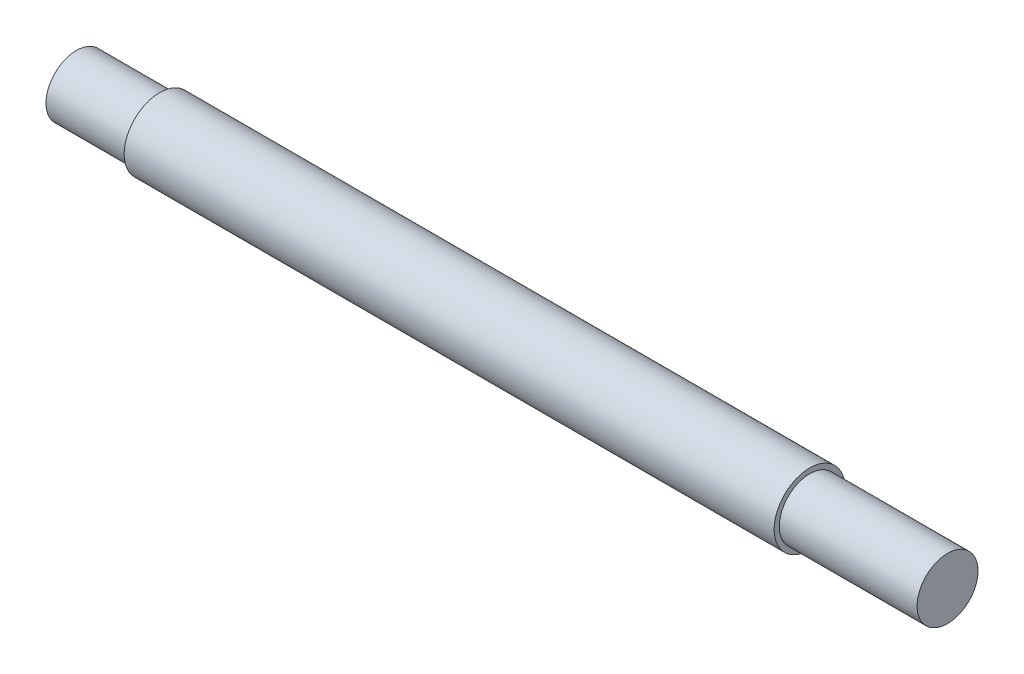
ISO-10303-21;
HEADER;
FILE_DESCRIPTION(('STEP AP214'),'2;1');
FILE_NAME('part.step','',(''),(''),'','','');
FILE_SCHEMA(('AUTOMOTIVE_DESIGN { 1 0 10303 214 1 1 1 1 }'));
ENDSEC;
DATA;
#1=APPLICATION_CONTEXT('core data for automotive mechanical design processes');
#2=APPLICATION_PROTOCOL_DEFINITION('international standard','automotive_design',2000,#1);
#3=PRODUCT_CONTEXT('',#1,'mechanical');
#4=PRODUCT('Part','Part','',(#3));
#5=PRODUCT_RELATED_PRODUCT_CATEGORY('part','',(#4));
#6=PRODUCT_DEFINITION_FORMATION('','',#4);
#7=PRODUCT_DEFINITION_CONTEXT('part definition',#1,'design');
#8=PRODUCT_DEFINITION('design','',#6,#7);
#9=PRODUCT_DEFINITION_SHAPE('','',#8);
#10=(LENGTH_UNIT() NAMED_UNIT(*) SI_UNIT(.MILLI.,.METRE.));
#11=(NAMED_UNIT(*) PLANE_ANGLE_UNIT() SI_UNIT($,.RADIAN.));
#12=(NAMED_UNIT(*) SI_UNIT($,.STERADIAN.) SOLID_ANGLE_UNIT());
#13=UNCERTAINTY_MEASURE_WITH_UNIT(LENGTH_MEASURE(1.E-05),#10,'distance_accuracy_value','');
#14=(GEOMETRIC_REPRESENTATION_CONTEXT(3) GLOBAL_UNCERTAINTY_ASSIGNED_CONTEXT((#13)) GLOBAL_UNIT_ASSIGNED_CONTEXT((#10,
#11,#12)) REPRESENTATION_CONTEXT('',''));
#15=CARTESIAN_POINT('',(0.,0.,0.));
#16=DIRECTION('',(0.,0.,1.));
#17=DIRECTION('',(1.,0.,0.));
#18=AXIS2_PLACEMENT_3D('',#15,#16,#17);
#19=CARTESIAN_POINT('',(-160.1,0.,0.));
#20=DIRECTION('',(1.,0.,0.));
#21=DIRECTION('',(0.,0.,-1.));
#22=AXIS2_PLACEMENT_3D('',#19,#20,#21);
#23=PLANE('',#22);
#24=CARTESIAN_POINT('',(-160.1,0.,0.));
#25=DIRECTION('',(1.,0.,0.));
#26=DIRECTION('',(0.,0.,-1.));
#27=AXIS2_PLACEMENT_3D('',#24,#25,#26);
#28=CIRCLE('',#27,17.5);
#29=CARTESIAN_POINT('',(-160.1,0.,-17.5));
#30=VERTEX_POINT('',#29);
#31=EDGE_CURVE('E27',#30,#30,#28,.T.);
#32=ORIENTED_EDGE('',*,*,#31,.F.);
#33=EDGE_LOOP('',(#32));
#34=FACE_BOUND('',#33,.T.);
#35=CARTESIAN_POINT('',(-160.1,0.,0.));
#36=DIRECTION('',(1.,0.,0.));
#37=DIRECTION('',(0.,0.,-1.));
#38=AXIS2_PLACEMENT_3D('',#35,#36,#37);
#39=CIRCLE('',#38,15.);
#40=CARTESIAN_POINT('',(-160.1,0.,-15.));
#41=VERTEX_POINT('',#40);
#42=EDGE_CURVE('E10',#41,#41,#39,.F.);
#43=ORIENTED_EDGE('',*,*,#42,.F.);
#44=EDGE_LOOP('',(#43));
#45=FACE_BOUND('',#44,.T.);
#46=ADVANCED_FACE('F15',(#34,#45),#23,.F.);
#47=CARTESIAN_POINT('',(160.1,0.,0.));
#48=DIRECTION('',(1.,0.,0.));
#49=DIRECTION('',(0.,0.,-1.));
#50=AXIS2_PLACEMENT_3D('',#47,#48,#49);
#51=PLANE('',#50);
#52=CARTESIAN_POINT('',(160.1,0.,0.));
#53=DIRECTION('',(1.,0.,0.));
#54=DIRECTION('',(0.,0.,-1.));
#55=AXIS2_PLACEMENT_3D('',#52,#53,#54);
#56=CIRCLE('',#55,17.5);
#57=CARTESIAN_POINT('',(160.1,0.,-17.5));
#58=VERTEX_POINT('',#57);
#59=EDGE_CURVE('E22',#58,#58,#56,.T.);
#60=ORIENTED_EDGE('',*,*,#59,.T.);
#61=EDGE_LOOP('',(#60));
#62=FACE_BOUND('',#61,.T.);
#63=CARTESIAN_POINT('',(160.1,0.,0.));
#64=DIRECTION('',(1.,0.,0.));
#65=DIRECTION('',(0.,0.,-1.));
#66=AXIS2_PLACEMENT_3D('',#63,#64,#65);
#67=CIRCLE('',#66,15.);
#68=CARTESIAN_POINT('',(160.1,0.,-15.));
#69=VERTEX_POINT('',#68);
#70=EDGE_CURVE('E38',#69,#69,#67,.T.);
#71=ORIENTED_EDGE('',*,*,#70,.F.);
#72=EDGE_LOOP('',(#71));
#73=FACE_BOUND('',#72,.T.);
#74=ADVANCED_FACE('F69',(#62,#73),#51,.T.);
#75=CARTESIAN_POINT('',(160.1,0.,0.));
#76=DIRECTION('',(-1.,0.,0.));
#77=DIRECTION('',(0.,0.,1.));
#78=AXIS2_PLACEMENT_3D('',#75,#76,#77);
#79=CYLINDRICAL_SURFACE('',#78,17.5);
#80=ORIENTED_EDGE('',*,*,#59,.F.);
#81=EDGE_LOOP('',(#80));
#82=FACE_BOUND('',#81,.T.);
#83=ORIENTED_EDGE('',*,*,#31,.T.);
#84=EDGE_LOOP('',(#83));
#85=FACE_BOUND('',#84,.T.);
#86=ADVANCED_FACE('F17',(#82,#85),#79,.T.);
#87=CARTESIAN_POINT('',(228.,0.,0.));
#88=DIRECTION('',(-1.,0.,0.));
#89=DIRECTION('',(0.,0.,1.));
#90=AXIS2_PLACEMENT_3D('',#87,#88,#89);
#91=CYLINDRICAL_SURFACE('',#90,15.);
#92=CARTESIAN_POINT('',(228.,0.,0.));
#93=DIRECTION('',(1.,0.,0.));
#94=DIRECTION('',(0.,0.,-1.));
#95=AXIS2_PLACEMENT_3D('',#92,#93,#94);
#96=CIRCLE('',#95,15.);
#97=CARTESIAN_POINT('',(228.,0.,-15.));
#98=VERTEX_POINT('',#97);
#99=EDGE_CURVE('E36',#98,#98,#96,.T.);
#100=ORIENTED_EDGE('',*,*,#99,.F.);
#101=EDGE_LOOP('',(#100));
#102=FACE_BOUND('',#101,.T.);
#103=ORIENTED_EDGE('',*,*,#70,.T.);
#104=EDGE_LOOP('',(#103));
#105=FACE_BOUND('',#104,.T.);
#106=ADVANCED_FACE('F65',(#102,#105),#91,.T.);
#107=CARTESIAN_POINT('',(228.,0.,0.));
#108=DIRECTION('',(1.,0.,0.));
#109=DIRECTION('',(0.,0.,-1.));
#110=AXIS2_PLACEMENT_3D('',#107,#108,#109);
#111=PLANE('',#110);
#112=ORIENTED_EDGE('',*,*,#99,.T.);
#113=EDGE_LOOP('',(#112));
#114=FACE_BOUND('',#113,.T.);
#115=ADVANCED_FACE('F56',(#114),#111,.T.);
#116=CARTESIAN_POINT('',(-201.1,0.,0.));
#117=DIRECTION('',(1.,0.,0.));
#118=DIRECTION('',(0.,0.,-1.));
#119=AXIS2_PLACEMENT_3D('',#116,#117,#118);
#120=CYLINDRICAL_SURFACE('',#119,15.);
#121=CARTESIAN_POINT('',(-201.1,0.,0.));
#122=DIRECTION('',(-1.,0.,0.));
#123=DIRECTION('',(0.,0.,1.));
#124=AXIS2_PLACEMENT_3D('',#121,#122,#123);
#125=CIRCLE('',#124,15.);
#126=CARTESIAN_POINT('',(-201.1,0.,15.));
#127=VERTEX_POINT('',#126);
#128=EDGE_CURVE('E42',#127,#127,#125,.T.);
#129=ORIENTED_EDGE('',*,*,#128,.F.);
#130=EDGE_LOOP('',(#129));
#131=FACE_BOUND('',#130,.T.);
#132=ORIENTED_EDGE('',*,*,#42,.T.);
#133=EDGE_LOOP('',(#132));
#134=FACE_BOUND('',#133,.T.);
#135=ADVANCED_FACE('F54',(#131,#134),#120,.T.);
#136=CARTESIAN_POINT('',(-201.1,0.,0.));
#137=DIRECTION('',(-1.,0.,0.));
#138=DIRECTION('',(0.,0.,1.));
#139=AXIS2_PLACEMENT_3D('',#136,#137,#138);
#140=PLANE('',#139);
#141=ORIENTED_EDGE('',*,*,#128,.T.);
#142=EDGE_LOOP('',(#141));
#143=FACE_BOUND('',#142,.T.);
#144=ADVANCED_FACE('F52',(#143),#140,.T.);
#145=CLOSED_SHELL('',(#46,#74,#86,#106,#115,#135,#144));
#146=MANIFOLD_SOLID_BREP('B1',#145);
#147=ADVANCED_BREP_SHAPE_REPRESENTATION('',(#18,#146),#14);
#148=SHAPE_DEFINITION_REPRESENTATION(#9,#147);
ENDSEC;
END-ISO-10303-21;
